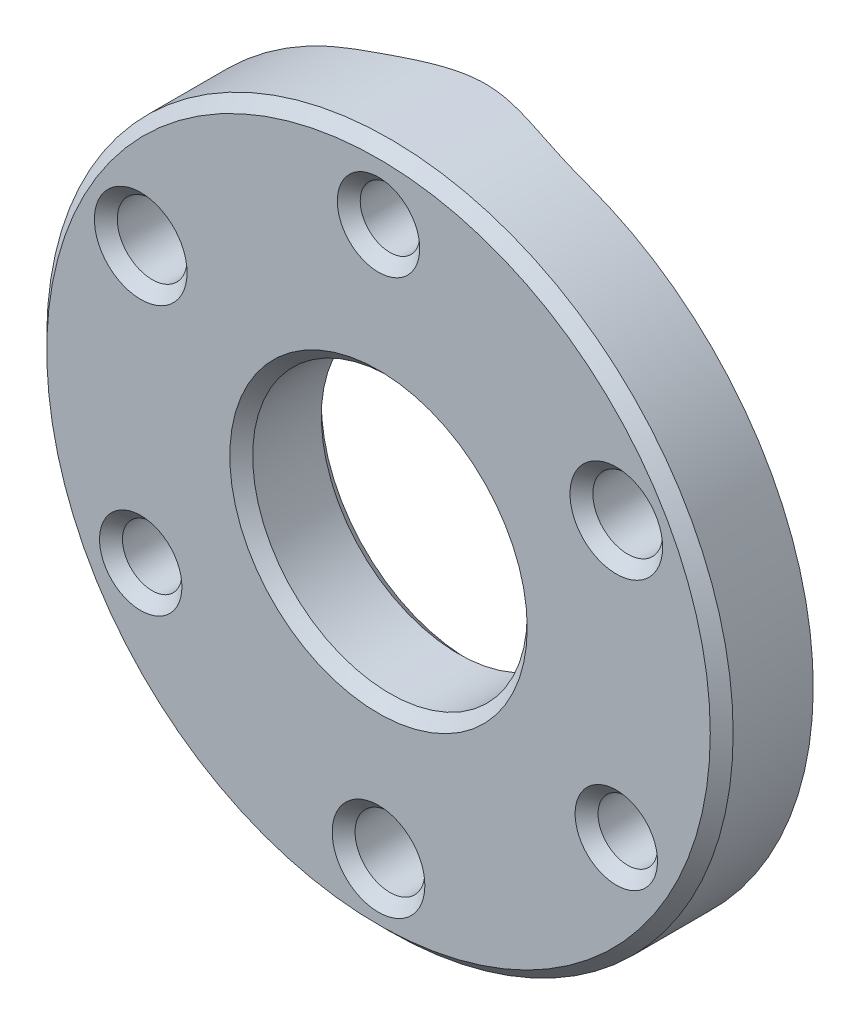
ISO-10303-21;
HEADER;
FILE_DESCRIPTION(('STEP AP214'),'2;1');
FILE_NAME('part.step','',(''),(''),'','','');
FILE_SCHEMA(('AUTOMOTIVE_DESIGN { 1 0 10303 214 1 1 1 1 }'));
ENDSEC;
DATA;
#1=APPLICATION_CONTEXT('core data for automotive mechanical design processes');
#2=APPLICATION_PROTOCOL_DEFINITION('international standard','automotive_design',2000,#1);
#3=PRODUCT_CONTEXT('',#1,'mechanical');
#4=PRODUCT('Part','Part','',(#3));
#5=PRODUCT_RELATED_PRODUCT_CATEGORY('part','',(#4));
#6=PRODUCT_DEFINITION_FORMATION('','',#4);
#7=PRODUCT_DEFINITION_CONTEXT('part definition',#1,'design');
#8=PRODUCT_DEFINITION('design','',#6,#7);
#9=PRODUCT_DEFINITION_SHAPE('','',#8);
#10=(LENGTH_UNIT() NAMED_UNIT(*) SI_UNIT(.MILLI.,.METRE.));
#11=(NAMED_UNIT(*) PLANE_ANGLE_UNIT() SI_UNIT($,.RADIAN.));
#12=(NAMED_UNIT(*) SI_UNIT($,.STERADIAN.) SOLID_ANGLE_UNIT());
#13=UNCERTAINTY_MEASURE_WITH_UNIT(LENGTH_MEASURE(1.E-05),#10,'distance_accuracy_value','');
#14=(GEOMETRIC_REPRESENTATION_CONTEXT(3) GLOBAL_UNCERTAINTY_ASSIGNED_CONTEXT((#13)) GLOBAL_UNIT_ASSIGNED_CONTEXT((#10,
#11,#12)) REPRESENTATION_CONTEXT('',''));
#15=CARTESIAN_POINT('',(0.,0.,0.));
#16=DIRECTION('',(0.,0.,1.));
#17=DIRECTION('',(1.,0.,0.));
#18=AXIS2_PLACEMENT_3D('',#15,#16,#17);
#19=CARTESIAN_POINT('',(0.,0.,0.));
#20=DIRECTION('',(0.,0.,1.));
#21=DIRECTION('',(1.,0.,0.));
#22=AXIS2_PLACEMENT_3D('',#19,#20,#21);
#23=PLANE('',#22);
#24=CARTESIAN_POINT('',(-1.28369537222284E-13,-12.,0.));
#25=DIRECTION('',(0.,0.,1.));
#26=DIRECTION('',(1.,0.,0.));
#27=AXIS2_PLACEMENT_3D('',#24,#25,#26);
#28=CIRCLE('',#27,2.02500000000001);
#29=CARTESIAN_POINT('',(2.02499999999988,-12.,0.));
#30=VERTEX_POINT('',#29);
#31=EDGE_CURVE('E57',#30,#30,#28,.T.);
#32=ORIENTED_EDGE('',*,*,#31,.T.);
#33=EDGE_LOOP('',(#32));
#34=FACE_BOUND('',#33,.T.);
#35=CARTESIAN_POINT('',(-10.3923048454132,6.00000000000016,0.));
#36=DIRECTION('',(0.,0.,1.));
#37=DIRECTION('',(1.,0.,0.));
#38=AXIS2_PLACEMENT_3D('',#35,#36,#37);
#39=CIRCLE('',#38,2.02500000000001);
#40=CARTESIAN_POINT('',(-8.36730484541316,6.00000000000016,0.));
#41=VERTEX_POINT('',#40);
#42=EDGE_CURVE('E480',#41,#41,#39,.T.);
#43=ORIENTED_EDGE('',*,*,#42,.T.);
#44=EDGE_LOOP('',(#43));
#45=FACE_BOUND('',#44,.T.);
#46=CARTESIAN_POINT('',(10.3923048454133,5.99999999999994,0.));
#47=DIRECTION('',(0.,0.,1.));
#48=DIRECTION('',(1.,0.,0.));
#49=AXIS2_PLACEMENT_3D('',#46,#47,#48);
#50=CIRCLE('',#49,2.02500000000001);
#51=CARTESIAN_POINT('',(12.4173048454133,5.99999999999994,0.));
#52=VERTEX_POINT('',#51);
#53=EDGE_CURVE('E470',#52,#52,#50,.T.);
#54=ORIENTED_EDGE('',*,*,#53,.T.);
#55=EDGE_LOOP('',(#54));
#56=FACE_BOUND('',#55,.T.);
#57=CARTESIAN_POINT('',(1.6306400674182E-13,12.,0.));
#58=DIRECTION('',(0.,0.,1.));
#59=DIRECTION('',(1.,0.,0.));
#60=AXIS2_PLACEMENT_3D('',#57,#58,#59);
#61=CIRCLE('',#60,5.5);
#62=CARTESIAN_POINT('',(-5.07725687023878,14.1145833333334,0.));
#63=VERTEX_POINT('',#62);
#64=CARTESIAN_POINT('',(0.,6.5,0.));
#65=VERTEX_POINT('',#64);
#66=EDGE_CURVE('E79',#63,#65,#61,.T.);
#67=ORIENTED_EDGE('',*,*,#66,.T.);
#68=CARTESIAN_POINT('',(0.,0.,0.));
#69=DIRECTION('',(0.,0.,1.));
#70=DIRECTION('',(1.,0.,0.));
#71=AXIS2_PLACEMENT_3D('',#68,#69,#70);
#72=CIRCLE('',#71,6.50000000000001);
#73=EDGE_CURVE('E12',#65,#65,#72,.T.);
#74=ORIENTED_EDGE('',*,*,#73,.T.);
#75=CARTESIAN_POINT('',(5.07725687023917,14.1145833333333,0.));
#76=VERTEX_POINT('',#75);
#77=EDGE_CURVE('E72',#65,#76,#61,.T.);
#78=ORIENTED_EDGE('',*,*,#77,.T.);
#79=CARTESIAN_POINT('',(0.,0.,0.));
#80=DIRECTION('',(0.,0.,1.));
#81=DIRECTION('',(1.,0.,0.));
#82=AXIS2_PLACEMENT_3D('',#79,#80,#81);
#83=CIRCLE('',#82,15.);
#84=EDGE_CURVE('E75',#63,#76,#83,.T.);
#85=ORIENTED_EDGE('',*,*,#84,.F.);
#86=EDGE_LOOP('',(#67,#74,#78,#85));
#87=FACE_BOUND('',#86,.T.);
#88=CARTESIAN_POINT('',(10.3923048454132,-6.00000000000005,0.));
#89=DIRECTION('',(0.,0.,1.));
#90=DIRECTION('',(1.,0.,0.));
#91=AXIS2_PLACEMENT_3D('',#88,#89,#90);
#92=CIRCLE('',#91,2.4);
#93=CARTESIAN_POINT('',(12.7923048454132,-6.00000000000005,0.));
#94=VERTEX_POINT('',#93);
#95=EDGE_CURVE('E89',#94,#94,#92,.T.);
#96=ORIENTED_EDGE('',*,*,#95,.T.);
#97=EDGE_LOOP('',(#96));
#98=FACE_BOUND('',#97,.T.);
#99=CARTESIAN_POINT('',(-10.3923048454133,-5.99999999999991,0.));
#100=DIRECTION('',(0.,0.,1.));
#101=DIRECTION('',(1.,0.,0.));
#102=AXIS2_PLACEMENT_3D('',#99,#100,#101);
#103=CIRCLE('',#102,2.4);
#104=CARTESIAN_POINT('',(-7.99230484541332,-5.99999999999991,0.));
#105=VERTEX_POINT('',#104);
#106=EDGE_CURVE('E95',#105,#105,#103,.T.);
#107=ORIENTED_EDGE('',*,*,#106,.T.);
#108=EDGE_LOOP('',(#107));
#109=FACE_BOUND('',#108,.T.);
#110=ADVANCED_FACE('F47',(#34,#45,#56,#87,#98,#109),#23,.F.);
#111=CARTESIAN_POINT('',(0.,0.,3.));
#112=DIRECTION('',(0.,0.,-1.));
#113=DIRECTION('',(-1.,0.,0.));
#114=AXIS2_PLACEMENT_3D('',#111,#112,#113);
#115=CYLINDRICAL_SURFACE('',#114,15.);
#116=CARTESIAN_POINT('',(0.,0.,3.49999999999999));
#117=DIRECTION('',(0.,0.,1.));
#118=DIRECTION('',(1.,0.,0.));
#119=AXIS2_PLACEMENT_3D('',#116,#117,#118);
#120=CIRCLE('',#119,15.);
#121=CARTESIAN_POINT('',(15.,0.,3.49999999999999));
#122=VERTEX_POINT('',#121);
#123=EDGE_CURVE('E505',#122,#122,#120,.F.);
#124=ORIENTED_EDGE('',*,*,#123,.T.);
#125=EDGE_LOOP('',(#124));
#126=FACE_BOUND('',#125,.T.);
#127=ORIENTED_EDGE('',*,*,#84,.T.);
#128=CARTESIAN_POINT('',(5.07725687023917,14.1145833333333,0.));
#129=CARTESIAN_POINT('',(4.94105848342498,14.1635820971113,2.08635130093524E-05));
#130=CARTESIAN_POINT('',(4.80417405801557,14.2105896585582,-0.00342587186651364));
#131=CARTESIAN_POINT('',(4.52945394339398,14.3005202530031,-0.0166530564790379));
#132=CARTESIAN_POINT('',(4.3916188307357,14.3434455619502,-0.0264299524778217));
#133=CARTESIAN_POINT('',(4.11611783092976,14.4249123594078,-0.0516392212973184));
#134=CARTESIAN_POINT('',(3.97845615424623,14.463479280468,-0.0670362999075104));
#135=CARTESIAN_POINT('',(3.70267611182586,14.5365242904194,-0.102740088044322));
#136=CARTESIAN_POINT('',(3.56455769146458,14.5710018706192,-0.12304740742523));
#137=CARTESIAN_POINT('',(3.28793008290181,14.635905040511,-0.167667377514925));
#138=CARTESIAN_POINT('',(3.1494207002825,14.6663280055367,-0.191982600094951));
#139=CARTESIAN_POINT('',(2.8721067538619,14.7231464218855,-0.243478616243506));
#140=CARTESIAN_POINT('',(2.73330216650309,14.7495415385423,-0.270659647609625));
#141=CARTESIAN_POINT('',(2.45498113167614,14.7984146771754,-0.326559665079048));
#142=CARTESIAN_POINT('',(2.31546378545282,14.8208837627437,-0.355281970229944));
#143=CARTESIAN_POINT('',(2.03581992743691,14.8618777336279,-0.41249577414324));
#144=CARTESIAN_POINT('',(1.89569342234337,14.880402662207,-0.44098727543402));
#145=CARTESIAN_POINT('',(1.5252121894954,14.9240516016692,-0.513086136809838));
#146=CARTESIAN_POINT('',(1.29404600511887,14.9458999905847,-0.55480815545136));
#147=CARTESIAN_POINT('',(0.945229672248521,14.9706399934723,-0.605129248312527));
#148=CARTESIAN_POINT('',(0.828760367274435,14.9775442517359,-0.619848484037692));
#149=CARTESIAN_POINT('',(0.595140788142695,14.9886451206156,-0.644040959820544));
#150=CARTESIAN_POINT('',(0.477990564502231,14.9928419295738,-0.653514584153128));
#151=CARTESIAN_POINT('',(0.243244425158518,14.9984871521564,-0.66635615581241));
#152=CARTESIAN_POINT('',(0.125648386460991,14.9999347421288,-0.669722273347586));
#153=CARTESIAN_POINT('',(-0.1095529694363,15.0000609401634,-0.670013717022539));
#154=CARTESIAN_POINT('',(-0.227158286595882,14.9987395596226,-0.666939069672339));
#155=CARTESIAN_POINT('',(-0.462228043534852,14.9933385038213,-0.654636751874051));
#156=CARTESIAN_POINT('',(-0.579691629723858,14.9892528742823,-0.645395799604362));
#157=CARTESIAN_POINT('',(-0.813944100566443,14.9783593003963,-0.621598408425579));
#158=CARTESIAN_POINT('',(-0.930732932587275,14.9715511465171,-0.607041560399324));
#159=CARTESIAN_POINT('',(-1.2173769688425,14.9514925561195,-0.566105657808445));
#160=CARTESIAN_POINT('',(-1.38678315684688,14.9367188435366,-0.537372943319522));
#161=CARTESIAN_POINT('',(-1.72412487586946,14.9015493907687,-0.475134484400073));
#162=CARTESIAN_POINT('',(-1.8920599927247,14.8811521166989,-0.441627438927914));
#163=CARTESIAN_POINT('',(-2.22681861656628,14.8347500069596,-0.373569990978726));
#164=CARTESIAN_POINT('',(-2.3936427904564,14.8087489217033,-0.339020299539199));
#165=CARTESIAN_POINT('',(-2.72669268925573,14.751057650349,-0.271872604506607));
#166=CARTESIAN_POINT('',(-2.89291846801079,14.7193679898798,-0.239274420963505));
#167=CARTESIAN_POINT('',(-3.22798739390478,14.6495700322255,-0.177854213611634));
#168=CARTESIAN_POINT('',(-3.3968233866239,14.6113558287444,-0.149111322006094));
#169=CARTESIAN_POINT('',(-3.73396567828567,14.52885431665,-0.0980756792855815));
#170=CARTESIAN_POINT('',(-3.90227208187898,14.4845682965046,-0.0757815628231853));
#171=CARTESIAN_POINT('',(-4.23915431701849,14.3895927694164,-0.0390404435013658));
#172=CARTESIAN_POINT('',(-4.40772488107008,14.3388637921583,-0.0246449962909613));
#173=CARTESIAN_POINT('',(-4.65959600380171,14.2581890218715,-0.0100027736625224));
#174=CARTESIAN_POINT('',(-4.74343598001448,14.2305169617321,-0.00628038919377368));
#175=CARTESIAN_POINT('',(-4.91068851506231,14.17367076181,-0.00127813107984774));
#176=CARTESIAN_POINT('',(-4.99410102408918,14.1444964511731,1.46410885882819E-06));
#177=CARTESIAN_POINT('',(-5.07725687023878,14.1145833333334,0.));
#178=B_SPLINE_CURVE_WITH_KNOTS('',3,(#128,#129,#130,#131,#132,#133,#134,#135,#136,#137,#138,
#139,#140,#141,#142,#143,#144,#145,#146,#147,#148,#149,#150,#151,#152,#153,#154,#155,#156,#157,
#158,#159,#160,#161,#162,#163,#164,#165,#166,#167,#168,#169,#170,#171,#172,#173,#174,#175,#176,
#177),.UNSPECIFIED.,.F.,.F.,(4,2,2,2,2,2,2,2,2,2,2,2,2,2,2,2,2,2,2,2,2,2,2,2,4),(0.,
0.434134035704884,0.868024595102362,1.29923596728143,1.73050092365706,2.16204370787645,
2.59362232865189,3.02617085917778,3.45871464485258,4.16582980381193,4.51850413837089,
4.87115263383898,5.22390676435057,5.57665944293813,5.93017439116751,6.28371655203045,
6.80083852495856,7.31810168804227,7.83501973606655,8.35189004502894,8.87812657402339,
9.40425160549211,9.93377106668686,10.1988302615721,10.4639196690682),.UNSPECIFIED.);
#179=EDGE_CURVE('E66',#76,#63,#178,.T.);
#180=ORIENTED_EDGE('',*,*,#179,.T.);
#181=EDGE_LOOP('',(#127,#180));
#182=FACE_BOUND('',#181,.T.);
#183=ADVANCED_FACE('F87',(#126,#182),#115,.T.);
#184=CARTESIAN_POINT('',(10.3923048454132,-6.00000000000005,3.));
#185=DIRECTION('',(0.,0.,-1.));
#186=DIRECTION('',(-1.,0.,0.));
#187=AXIS2_PLACEMENT_3D('',#184,#185,#186);
#188=CYLINDRICAL_SURFACE('',#187,1.3);
#189=CARTESIAN_POINT('',(10.3923048454132,-6.00000000000005,3.5));
#190=DIRECTION('',(0.,0.,1.));
#191=DIRECTION('',(1.,0.,0.));
#192=AXIS2_PLACEMENT_3D('',#189,#190,#191);
#193=CIRCLE('',#192,1.3);
#194=CARTESIAN_POINT('',(11.6923048454132,-6.00000000000005,3.5));
#195=VERTEX_POINT('',#194);
#196=EDGE_CURVE('E466',#195,#195,#193,.T.);
#197=ORIENTED_EDGE('',*,*,#196,.T.);
#198=EDGE_LOOP('',(#197));
#199=FACE_BOUND('',#198,.T.);
#200=CARTESIAN_POINT('',(10.3923048454132,-6.00000000000005,1.1));
#201=DIRECTION('',(0.,0.,1.));
#202=DIRECTION('',(1.,0.,0.));
#203=AXIS2_PLACEMENT_3D('',#200,#201,#202);
#204=CIRCLE('',#203,1.3);
#205=CARTESIAN_POINT('',(11.6923048454132,-6.00000000000005,1.1));
#206=VERTEX_POINT('',#205);
#207=EDGE_CURVE('E80',#206,#206,#204,.F.);
#208=ORIENTED_EDGE('',*,*,#207,.T.);
#209=EDGE_LOOP('',(#208));
#210=FACE_BOUND('',#209,.T.);
#211=ADVANCED_FACE('F217',(#199,#210),#188,.F.);
#212=CARTESIAN_POINT('',(-10.3923048454133,-5.99999999999991,3.));
#213=DIRECTION('',(0.,0.,-1.));
#214=DIRECTION('',(-1.,0.,0.));
#215=AXIS2_PLACEMENT_3D('',#212,#213,#214);
#216=CYLINDRICAL_SURFACE('',#215,1.3);
#217=CARTESIAN_POINT('',(-10.3923048454133,-5.99999999999991,3.5));
#218=DIRECTION('',(0.,0.,1.));
#219=DIRECTION('',(1.,0.,0.));
#220=AXIS2_PLACEMENT_3D('',#217,#218,#219);
#221=CIRCLE('',#220,1.3);
#222=CARTESIAN_POINT('',(-9.09230484541332,-5.99999999999991,3.5));
#223=VERTEX_POINT('',#222);
#224=EDGE_CURVE('E473',#223,#223,#221,.T.);
#225=ORIENTED_EDGE('',*,*,#224,.T.);
#226=EDGE_LOOP('',(#225));
#227=FACE_BOUND('',#226,.T.);
#228=CARTESIAN_POINT('',(-10.3923048454133,-5.99999999999991,1.1));
#229=DIRECTION('',(0.,0.,1.));
#230=DIRECTION('',(1.,0.,0.));
#231=AXIS2_PLACEMENT_3D('',#228,#229,#230);
#232=CIRCLE('',#231,1.3);
#233=CARTESIAN_POINT('',(-9.09230484541332,-5.99999999999991,1.1));
#234=VERTEX_POINT('',#233);
#235=EDGE_CURVE('E105',#234,#234,#232,.F.);
#236=ORIENTED_EDGE('',*,*,#235,.T.);
#237=EDGE_LOOP('',(#236));
#238=FACE_BOUND('',#237,.T.);
#239=ADVANCED_FACE('F224',(#227,#238),#216,.F.);
#240=CARTESIAN_POINT('',(1.6306400674182E-13,12.,3.));
#241=DIRECTION('',(0.,0.,-1.));
#242=DIRECTION('',(-1.,0.,0.));
#243=AXIS2_PLACEMENT_3D('',#240,#241,#242);
#244=CYLINDRICAL_SURFACE('',#243,1.3);
#245=CARTESIAN_POINT('',(1.6306400674182E-13,12.,3.5));
#246=DIRECTION('',(0.,0.,1.));
#247=DIRECTION('',(1.,0.,0.));
#248=AXIS2_PLACEMENT_3D('',#245,#246,#247);
#249=CIRCLE('',#248,1.3);
#250=CARTESIAN_POINT('',(1.30000000000016,12.,3.5));
#251=VERTEX_POINT('',#250);
#252=EDGE_CURVE('E493',#251,#251,#249,.T.);
#253=ORIENTED_EDGE('',*,*,#252,.T.);
#254=EDGE_LOOP('',(#253));
#255=FACE_BOUND('',#254,.T.);
#256=CARTESIAN_POINT('',(1.6306400674182E-13,12.,-1.));
#257=DIRECTION('',(0.,0.,-1.));
#258=DIRECTION('',(-1.,0.,0.));
#259=AXIS2_PLACEMENT_3D('',#256,#257,#258);
#260=CIRCLE('',#259,1.3);
#261=CARTESIAN_POINT('',(-1.29999999999984,12.,-1.));
#262=VERTEX_POINT('',#261);
#263=EDGE_CURVE('E98',#262,#262,#260,.T.);
#264=ORIENTED_EDGE('',*,*,#263,.T.);
#265=EDGE_LOOP('',(#264));
#266=FACE_BOUND('',#265,.T.);
#267=ADVANCED_FACE('F228',(#255,#266),#244,.F.);
#268=CARTESIAN_POINT('',(-10.3923048454132,6.00000000000016,4.));
#269=DIRECTION('',(0.,0.,-1.));
#270=DIRECTION('',(-1.,0.,0.));
#271=AXIS2_PLACEMENT_3D('',#268,#269,#270);
#272=CYLINDRICAL_SURFACE('',#271,1.525);
#273=CARTESIAN_POINT('',(-10.3923048454132,6.00000000000016,3.5));
#274=DIRECTION('',(0.,0.,1.));
#275=DIRECTION('',(1.,0.,0.));
#276=AXIS2_PLACEMENT_3D('',#273,#274,#275);
#277=CIRCLE('',#276,1.525);
#278=CARTESIAN_POINT('',(-8.86730484541317,6.00000000000016,3.5));
#279=VERTEX_POINT('',#278);
#280=EDGE_CURVE('E548',#279,#279,#277,.T.);
#281=ORIENTED_EDGE('',*,*,#280,.T.);
#282=EDGE_LOOP('',(#281));
#283=FACE_BOUND('',#282,.T.);
#284=CARTESIAN_POINT('',(-10.3923048454132,6.00000000000016,0.500000000000014));
#285=DIRECTION('',(0.,0.,1.));
#286=DIRECTION('',(1.,0.,0.));
#287=AXIS2_PLACEMENT_3D('',#284,#285,#286);
#288=CIRCLE('',#287,1.525);
#289=CARTESIAN_POINT('',(-8.86730484541317,6.00000000000016,0.500000000000014));
#290=VERTEX_POINT('',#289);
#291=EDGE_CURVE('E85',#290,#290,#288,.F.);
#292=ORIENTED_EDGE('',*,*,#291,.T.);
#293=EDGE_LOOP('',(#292));
#294=FACE_BOUND('',#293,.T.);
#295=ADVANCED_FACE('F232',(#283,#294),#272,.F.);
#296=CARTESIAN_POINT('',(-1.28369537222284E-13,-12.,4.));
#297=DIRECTION('',(0.,0.,-1.));
#298=DIRECTION('',(-1.,0.,0.));
#299=AXIS2_PLACEMENT_3D('',#296,#297,#298);
#300=CYLINDRICAL_SURFACE('',#299,1.525);
#301=CARTESIAN_POINT('',(-1.28369537222284E-13,-12.,3.5));
#302=DIRECTION('',(0.,0.,1.));
#303=DIRECTION('',(1.,0.,0.));
#304=AXIS2_PLACEMENT_3D('',#301,#302,#303);
#305=CIRCLE('',#304,1.525);
#306=CARTESIAN_POINT('',(1.52499999999987,-12.,3.5));
#307=VERTEX_POINT('',#306);
#308=EDGE_CURVE('E497',#307,#307,#305,.T.);
#309=ORIENTED_EDGE('',*,*,#308,.T.);
#310=EDGE_LOOP('',(#309));
#311=FACE_BOUND('',#310,.T.);
#312=CARTESIAN_POINT('',(-1.28369537222284E-13,-12.,0.500000000000015));
#313=DIRECTION('',(0.,0.,1.));
#314=DIRECTION('',(1.,0.,0.));
#315=AXIS2_PLACEMENT_3D('',#312,#313,#314);
#316=CIRCLE('',#315,1.525);
#317=CARTESIAN_POINT('',(1.52499999999987,-12.,0.500000000000015));
#318=VERTEX_POINT('',#317);
#319=EDGE_CURVE('E501',#318,#318,#316,.F.);
#320=ORIENTED_EDGE('',*,*,#319,.T.);
#321=EDGE_LOOP('',(#320));
#322=FACE_BOUND('',#321,.T.);
#323=ADVANCED_FACE('F242',(#311,#322),#300,.F.);
#324=CARTESIAN_POINT('',(10.3923048454133,5.99999999999994,4.));
#325=DIRECTION('',(0.,0.,-1.));
#326=DIRECTION('',(-1.,0.,0.));
#327=AXIS2_PLACEMENT_3D('',#324,#325,#326);
#328=CYLINDRICAL_SURFACE('',#327,1.525);
#329=CARTESIAN_POINT('',(10.3923048454133,5.99999999999994,3.49999999999999));
#330=DIRECTION('',(0.,0.,1.));
#331=DIRECTION('',(1.,0.,0.));
#332=AXIS2_PLACEMENT_3D('',#329,#330,#331);
#333=CIRCLE('',#332,1.525);
#334=CARTESIAN_POINT('',(11.9173048454133,5.99999999999994,3.49999999999999));
#335=VERTEX_POINT('',#334);
#336=EDGE_CURVE('E509',#335,#335,#333,.T.);
#337=ORIENTED_EDGE('',*,*,#336,.T.);
#338=EDGE_LOOP('',(#337));
#339=FACE_BOUND('',#338,.T.);
#340=CARTESIAN_POINT('',(10.3923048454133,5.99999999999994,0.500000000000012));
#341=DIRECTION('',(0.,0.,1.));
#342=DIRECTION('',(1.,0.,0.));
#343=AXIS2_PLACEMENT_3D('',#340,#341,#342);
#344=CIRCLE('',#343,1.525);
#345=CARTESIAN_POINT('',(11.9173048454133,5.99999999999994,0.500000000000012));
#346=VERTEX_POINT('',#345);
#347=EDGE_CURVE('E513',#346,#346,#344,.F.);
#348=ORIENTED_EDGE('',*,*,#347,.T.);
#349=EDGE_LOOP('',(#348));
#350=FACE_BOUND('',#349,.T.);
#351=ADVANCED_FACE('F238',(#339,#350),#328,.F.);
#352=CARTESIAN_POINT('',(0.,0.,4.));
#353=DIRECTION('',(0.,0.,1.));
#354=DIRECTION('',(1.,0.,0.));
#355=AXIS2_PLACEMENT_3D('',#352,#353,#354);
#356=PLANE('',#355);
#357=CARTESIAN_POINT('',(-10.3923048454132,6.00000000000016,4.));
#358=DIRECTION('',(0.,0.,1.));
#359=DIRECTION('',(1.,0.,0.));
#360=AXIS2_PLACEMENT_3D('',#357,#358,#359);
#361=CIRCLE('',#360,2.025);
#362=CARTESIAN_POINT('',(-8.36730484541317,6.00000000000016,4.));
#363=VERTEX_POINT('',#362);
#364=EDGE_CURVE('E517',#363,#363,#361,.F.);
#365=ORIENTED_EDGE('',*,*,#364,.T.);
#366=EDGE_LOOP('',(#365));
#367=FACE_BOUND('',#366,.T.);
#368=CARTESIAN_POINT('',(10.3923048454133,5.99999999999994,4.));
#369=DIRECTION('',(0.,0.,1.));
#370=DIRECTION('',(1.,0.,0.));
#371=AXIS2_PLACEMENT_3D('',#368,#369,#370);
#372=CIRCLE('',#371,2.02500000000002);
#373=CARTESIAN_POINT('',(12.4173048454133,5.99999999999994,4.));
#374=VERTEX_POINT('',#373);
#375=EDGE_CURVE('E521',#374,#374,#372,.F.);
#376=ORIENTED_EDGE('',*,*,#375,.T.);
#377=EDGE_LOOP('',(#376));
#378=FACE_BOUND('',#377,.T.);
#379=CARTESIAN_POINT('',(0.,0.,4.));
#380=DIRECTION('',(0.,0.,1.));
#381=DIRECTION('',(1.,0.,0.));
#382=AXIS2_PLACEMENT_3D('',#379,#380,#381);
#383=CIRCLE('',#382,14.5);
#384=CARTESIAN_POINT('',(14.5,0.,4.));
#385=VERTEX_POINT('',#384);
#386=EDGE_CURVE('E525',#385,#385,#383,.T.);
#387=ORIENTED_EDGE('',*,*,#386,.T.);
#388=EDGE_LOOP('',(#387));
#389=FACE_BOUND('',#388,.T.);
#390=CARTESIAN_POINT('',(-1.28369537222284E-13,-12.,4.));
#391=DIRECTION('',(0.,0.,1.));
#392=DIRECTION('',(1.,0.,0.));
#393=AXIS2_PLACEMENT_3D('',#390,#391,#392);
#394=CIRCLE('',#393,2.025);
#395=CARTESIAN_POINT('',(2.02499999999987,-12.,4.));
#396=VERTEX_POINT('',#395);
#397=EDGE_CURVE('E529',#396,#396,#394,.F.);
#398=ORIENTED_EDGE('',*,*,#397,.T.);
#399=EDGE_LOOP('',(#398));
#400=FACE_BOUND('',#399,.T.);
#401=CARTESIAN_POINT('',(1.6306400674182E-13,12.,4.));
#402=DIRECTION('',(0.,0.,1.));
#403=DIRECTION('',(1.,0.,0.));
#404=AXIS2_PLACEMENT_3D('',#401,#402,#403);
#405=CIRCLE('',#404,1.8);
#406=CARTESIAN_POINT('',(1.80000000000017,12.,4.));
#407=VERTEX_POINT('',#406);
#408=EDGE_CURVE('E533',#407,#407,#405,.F.);
#409=ORIENTED_EDGE('',*,*,#408,.T.);
#410=EDGE_LOOP('',(#409));
#411=FACE_BOUND('',#410,.T.);
#412=CARTESIAN_POINT('',(-10.3923048454133,-5.99999999999991,4.));
#413=DIRECTION('',(0.,0.,1.));
#414=DIRECTION('',(1.,0.,0.));
#415=AXIS2_PLACEMENT_3D('',#412,#413,#414);
#416=CIRCLE('',#415,1.8);
#417=CARTESIAN_POINT('',(-8.59230484541332,-5.99999999999991,4.));
#418=VERTEX_POINT('',#417);
#419=EDGE_CURVE('E537',#418,#418,#416,.F.);
#420=ORIENTED_EDGE('',*,*,#419,.T.);
#421=EDGE_LOOP('',(#420));
#422=FACE_BOUND('',#421,.T.);
#423=CARTESIAN_POINT('',(10.3923048454132,-6.00000000000005,4.));
#424=DIRECTION('',(0.,0.,1.));
#425=DIRECTION('',(1.,0.,0.));
#426=AXIS2_PLACEMENT_3D('',#423,#424,#425);
#427=CIRCLE('',#426,1.8);
#428=CARTESIAN_POINT('',(12.1923048454132,-6.00000000000005,4.));
#429=VERTEX_POINT('',#428);
#430=EDGE_CURVE('E541',#429,#429,#427,.F.);
#431=ORIENTED_EDGE('',*,*,#430,.T.);
#432=EDGE_LOOP('',(#431));
#433=FACE_BOUND('',#432,.T.);
#434=CARTESIAN_POINT('',(0.,0.,4.));
#435=DIRECTION('',(0.,0.,1.));
#436=DIRECTION('',(1.,0.,0.));
#437=AXIS2_PLACEMENT_3D('',#434,#435,#436);
#438=CIRCLE('',#437,6.50000000000001);
#439=CARTESIAN_POINT('',(6.50000000000001,0.,4.));
#440=VERTEX_POINT('',#439);
#441=EDGE_CURVE('E545',#440,#440,#438,.F.);
#442=ORIENTED_EDGE('',*,*,#441,.T.);
#443=EDGE_LOOP('',(#442));
#444=FACE_BOUND('',#443,.T.);
#445=ADVANCED_FACE('F234',(#367,#378,#389,#400,#411,#422,#433,#444),#356,.T.);
#446=CARTESIAN_POINT('',(0.,0.,0.));
#447=DIRECTION('',(0.,0.,1.));
#448=DIRECTION('',(1.,0.,0.));
#449=AXIS2_PLACEMENT_3D('',#446,#447,#448);
#450=CYLINDRICAL_SURFACE('',#449,6.);
#451=CARTESIAN_POINT('',(0.,0.,3.5));
#452=DIRECTION('',(0.,0.,1.));
#453=DIRECTION('',(1.,0.,0.));
#454=AXIS2_PLACEMENT_3D('',#451,#452,#453);
#455=CIRCLE('',#454,6.);
#456=CARTESIAN_POINT('',(6.,0.,3.5));
#457=VERTEX_POINT('',#456);
#458=EDGE_CURVE('E461',#457,#457,#455,.T.);
#459=ORIENTED_EDGE('',*,*,#458,.T.);
#460=EDGE_LOOP('',(#459));
#461=FACE_BOUND('',#460,.T.);
#462=CARTESIAN_POINT('',(0.,0.,0.500000000000007));
#463=DIRECTION('',(0.,0.,1.));
#464=DIRECTION('',(1.,0.,0.));
#465=AXIS2_PLACEMENT_3D('',#462,#463,#464);
#466=CIRCLE('',#465,6.);
#467=CARTESIAN_POINT('',(6.,0.,0.500000000000007));
#468=VERTEX_POINT('',#467);
#469=EDGE_CURVE('E464',#468,#468,#466,.F.);
#470=ORIENTED_EDGE('',*,*,#469,.T.);
#471=EDGE_LOOP('',(#470));
#472=FACE_BOUND('',#471,.T.);
#473=ADVANCED_FACE('F237',(#461,#472),#450,.F.);
#474=CARTESIAN_POINT('',(-10.3923048454133,-5.99999999999991,0.));
#475=DIRECTION('',(0.,0.,-1.));
#476=DIRECTION('',(-1.,0.,0.));
#477=AXIS2_PLACEMENT_3D('',#474,#475,#476);
#478=CONICAL_SURFACE('',#477,2.4,0.785398163397447);
#479=ORIENTED_EDGE('',*,*,#235,.F.);
#480=EDGE_LOOP('',(#479));
#481=FACE_BOUND('',#480,.T.);
#482=ORIENTED_EDGE('',*,*,#106,.F.);
#483=EDGE_LOOP('',(#482));
#484=FACE_BOUND('',#483,.T.);
#485=ADVANCED_FACE('F252',(#481,#484),#478,.F.);
#486=CARTESIAN_POINT('',(10.3923048454132,-6.00000000000005,0.));
#487=DIRECTION('',(0.,0.,-1.));
#488=DIRECTION('',(-1.,0.,0.));
#489=AXIS2_PLACEMENT_3D('',#486,#487,#488);
#490=CONICAL_SURFACE('',#489,2.4,0.785398163397446);
#491=ORIENTED_EDGE('',*,*,#207,.F.);
#492=EDGE_LOOP('',(#491));
#493=FACE_BOUND('',#492,.T.);
#494=ORIENTED_EDGE('',*,*,#95,.F.);
#495=EDGE_LOOP('',(#494));
#496=FACE_BOUND('',#495,.T.);
#497=ADVANCED_FACE('F130',(#493,#496),#490,.F.);
#498=CARTESIAN_POINT('',(1.6306400674182E-13,12.,-1.));
#499=DIRECTION('',(0.,0.,-1.));
#500=DIRECTION('',(-1.,0.,0.));
#501=AXIS2_PLACEMENT_3D('',#498,#499,#500);
#502=PLANE('',#501);
#503=CARTESIAN_POINT('',(1.6306400674182E-13,12.,-1.));
#504=DIRECTION('',(0.,0.,-1.));
#505=DIRECTION('',(-1.,0.,0.));
#506=AXIS2_PLACEMENT_3D('',#503,#504,#505);
#507=CIRCLE('',#506,2.5);
#508=CARTESIAN_POINT('',(-2.49999999999984,12.,-1.));
#509=VERTEX_POINT('',#508);
#510=EDGE_CURVE('E90',#509,#509,#507,.T.);
#511=ORIENTED_EDGE('',*,*,#510,.T.);
#512=EDGE_LOOP('',(#511));
#513=FACE_BOUND('',#512,.T.);
#514=ORIENTED_EDGE('',*,*,#263,.F.);
#515=EDGE_LOOP('',(#514));
#516=FACE_BOUND('',#515,.T.);
#517=ADVANCED_FACE('F128',(#513,#516),#502,.T.);
#518=CARTESIAN_POINT('',(1.6306400674182E-13,12.,-5.));
#519=DIRECTION('',(0.,0.,1.));
#520=DIRECTION('',(1.,0.,0.));
#521=AXIS2_PLACEMENT_3D('',#518,#519,#520);
#522=TOROIDAL_SURFACE('',#521,5.5,5.);
#523=ORIENTED_EDGE('',*,*,#179,.F.);
#524=ORIENTED_EDGE('',*,*,#77,.F.);
#525=ORIENTED_EDGE('',*,*,#66,.F.);
#526=EDGE_LOOP('',(#523,#524,#525));
#527=FACE_BOUND('',#526,.T.);
#528=ORIENTED_EDGE('',*,*,#510,.F.);
#529=EDGE_LOOP('',(#528));
#530=FACE_BOUND('',#529,.T.);
#531=ADVANCED_FACE('F82',(#527,#530),#522,.F.);
#532=CARTESIAN_POINT('',(-10.3923048454132,6.00000000000016,3.5));
#533=DIRECTION('',(0.,0.,1.));
#534=DIRECTION('',(1.,0.,0.));
#535=AXIS2_PLACEMENT_3D('',#532,#533,#534);
#536=CONICAL_SURFACE('',#535,1.525,0.785398163397447);
#537=ORIENTED_EDGE('',*,*,#364,.F.);
#538=EDGE_LOOP('',(#537));
#539=FACE_BOUND('',#538,.T.);
#540=ORIENTED_EDGE('',*,*,#280,.F.);
#541=EDGE_LOOP('',(#540));
#542=FACE_BOUND('',#541,.T.);
#543=ADVANCED_FACE('F127',(#539,#542),#536,.F.);
#544=CARTESIAN_POINT('',(10.3923048454133,5.99999999999994,3.49999999999999));
#545=DIRECTION('',(0.,0.,1.));
#546=DIRECTION('',(1.,0.,0.));
#547=AXIS2_PLACEMENT_3D('',#544,#545,#546);
#548=CONICAL_SURFACE('',#547,1.525,0.785398163397453);
#549=ORIENTED_EDGE('',*,*,#375,.F.);
#550=EDGE_LOOP('',(#549));
#551=FACE_BOUND('',#550,.T.);
#552=ORIENTED_EDGE('',*,*,#336,.F.);
#553=EDGE_LOOP('',(#552));
#554=FACE_BOUND('',#553,.T.);
#555=ADVANCED_FACE('F137',(#551,#554),#548,.F.);
#556=CARTESIAN_POINT('',(0.,0.,4.));
#557=DIRECTION('',(0.,0.,-1.));
#558=DIRECTION('',(-1.,0.,0.));
#559=AXIS2_PLACEMENT_3D('',#556,#557,#558);
#560=CONICAL_SURFACE('',#559,14.5,0.785398163397441);
#561=ORIENTED_EDGE('',*,*,#123,.F.);
#562=EDGE_LOOP('',(#561));
#563=FACE_BOUND('',#562,.T.);
#564=ORIENTED_EDGE('',*,*,#386,.F.);
#565=EDGE_LOOP('',(#564));
#566=FACE_BOUND('',#565,.T.);
#567=ADVANCED_FACE('F144',(#563,#566),#560,.T.);
#568=CARTESIAN_POINT('',(-1.28369537222284E-13,-12.,3.5));
#569=DIRECTION('',(0.,0.,1.));
#570=DIRECTION('',(1.,0.,0.));
#571=AXIS2_PLACEMENT_3D('',#568,#569,#570);
#572=CONICAL_SURFACE('',#571,1.525,0.785398163397447);
#573=ORIENTED_EDGE('',*,*,#397,.F.);
#574=EDGE_LOOP('',(#573));
#575=FACE_BOUND('',#574,.T.);
#576=ORIENTED_EDGE('',*,*,#308,.F.);
#577=EDGE_LOOP('',(#576));
#578=FACE_BOUND('',#577,.T.);
#579=ADVANCED_FACE('F151',(#575,#578),#572,.F.);
#580=CARTESIAN_POINT('',(1.6306400674182E-13,12.,3.5));
#581=DIRECTION('',(0.,0.,1.));
#582=DIRECTION('',(1.,0.,0.));
#583=AXIS2_PLACEMENT_3D('',#580,#581,#582);
#584=CONICAL_SURFACE('',#583,1.3,0.785398163397447);
#585=ORIENTED_EDGE('',*,*,#408,.F.);
#586=EDGE_LOOP('',(#585));
#587=FACE_BOUND('',#586,.T.);
#588=ORIENTED_EDGE('',*,*,#252,.F.);
#589=EDGE_LOOP('',(#588));
#590=FACE_BOUND('',#589,.T.);
#591=ADVANCED_FACE('F158',(#587,#590),#584,.F.);
#592=CARTESIAN_POINT('',(-10.3923048454133,-5.99999999999991,3.5));
#593=DIRECTION('',(0.,0.,1.));
#594=DIRECTION('',(1.,0.,0.));
#595=AXIS2_PLACEMENT_3D('',#592,#593,#594);
#596=CONICAL_SURFACE('',#595,1.3,0.785398163397447);
#597=ORIENTED_EDGE('',*,*,#419,.F.);
#598=EDGE_LOOP('',(#597));
#599=FACE_BOUND('',#598,.T.);
#600=ORIENTED_EDGE('',*,*,#224,.F.);
#601=EDGE_LOOP('',(#600));
#602=FACE_BOUND('',#601,.T.);
#603=ADVANCED_FACE('F165',(#599,#602),#596,.F.);
#604=CARTESIAN_POINT('',(10.3923048454132,-6.00000000000005,3.5));
#605=DIRECTION('',(0.,0.,1.));
#606=DIRECTION('',(1.,0.,0.));
#607=AXIS2_PLACEMENT_3D('',#604,#605,#606);
#608=CONICAL_SURFACE('',#607,1.3,0.785398163397447);
#609=ORIENTED_EDGE('',*,*,#430,.F.);
#610=EDGE_LOOP('',(#609));
#611=FACE_BOUND('',#610,.T.);
#612=ORIENTED_EDGE('',*,*,#196,.F.);
#613=EDGE_LOOP('',(#612));
#614=FACE_BOUND('',#613,.T.);
#615=ADVANCED_FACE('F172',(#611,#614),#608,.F.);
#616=CARTESIAN_POINT('',(0.,0.,3.5));
#617=DIRECTION('',(0.,0.,1.));
#618=DIRECTION('',(1.,0.,0.));
#619=AXIS2_PLACEMENT_3D('',#616,#617,#618);
#620=CONICAL_SURFACE('',#619,6.,0.785398163397452);
#621=ORIENTED_EDGE('',*,*,#441,.F.);
#622=EDGE_LOOP('',(#621));
#623=FACE_BOUND('',#622,.T.);
#624=ORIENTED_EDGE('',*,*,#458,.F.);
#625=EDGE_LOOP('',(#624));
#626=FACE_BOUND('',#625,.T.);
#627=ADVANCED_FACE('F179',(#623,#626),#620,.F.);
#628=CARTESIAN_POINT('',(0.,0.,0.));
#629=DIRECTION('',(0.,0.,-1.));
#630=DIRECTION('',(-1.,0.,0.));
#631=AXIS2_PLACEMENT_3D('',#628,#629,#630);
#632=CONICAL_SURFACE('',#631,6.50000000000001,0.785398163397446);
#633=ORIENTED_EDGE('',*,*,#469,.F.);
#634=EDGE_LOOP('',(#633));
#635=FACE_BOUND('',#634,.T.);
#636=ORIENTED_EDGE('',*,*,#73,.F.);
#637=EDGE_LOOP('',(#636));
#638=FACE_BOUND('',#637,.T.);
#639=ADVANCED_FACE('F186',(#635,#638),#632,.F.);
#640=CARTESIAN_POINT('',(-1.28369537222284E-13,-12.,0.));
#641=DIRECTION('',(0.,0.,-1.));
#642=DIRECTION('',(-1.,0.,0.));
#643=AXIS2_PLACEMENT_3D('',#640,#641,#642);
#644=CONICAL_SURFACE('',#643,2.02500000000001,0.785398163397447);
#645=ORIENTED_EDGE('',*,*,#319,.F.);
#646=EDGE_LOOP('',(#645));
#647=FACE_BOUND('',#646,.T.);
#648=ORIENTED_EDGE('',*,*,#31,.F.);
#649=EDGE_LOOP('',(#648));
#650=FACE_BOUND('',#649,.T.);
#651=ADVANCED_FACE('F193',(#647,#650),#644,.F.);
#652=CARTESIAN_POINT('',(-10.3923048454132,6.00000000000016,0.));
#653=DIRECTION('',(0.,0.,-1.));
#654=DIRECTION('',(-1.,0.,0.));
#655=AXIS2_PLACEMENT_3D('',#652,#653,#654);
#656=CONICAL_SURFACE('',#655,2.02500000000001,0.785398163397447);
#657=ORIENTED_EDGE('',*,*,#291,.F.);
#658=EDGE_LOOP('',(#657));
#659=FACE_BOUND('',#658,.T.);
#660=ORIENTED_EDGE('',*,*,#42,.F.);
#661=EDGE_LOOP('',(#660));
#662=FACE_BOUND('',#661,.T.);
#663=ADVANCED_FACE('F199',(#659,#662),#656,.F.);
#664=CARTESIAN_POINT('',(10.3923048454133,5.99999999999994,0.));
#665=DIRECTION('',(0.,0.,-1.));
#666=DIRECTION('',(-1.,0.,0.));
#667=AXIS2_PLACEMENT_3D('',#664,#665,#666);
#668=CONICAL_SURFACE('',#667,2.02500000000001,0.785398163397447);
#669=ORIENTED_EDGE('',*,*,#347,.F.);
#670=EDGE_LOOP('',(#669));
#671=FACE_BOUND('',#670,.T.);
#672=ORIENTED_EDGE('',*,*,#53,.F.);
#673=EDGE_LOOP('',(#672));
#674=FACE_BOUND('',#673,.T.);
#675=ADVANCED_FACE('F50',(#671,#674),#668,.F.);
#676=CLOSED_SHELL('',(#110,#183,#211,#239,#267,#295,#323,#351,#445,#473,#485,#497,#517,#531,
#543,#555,#567,#579,#591,#603,#615,#627,#639,#651,#663,#675));
#677=MANIFOLD_SOLID_BREP('B2',#676);
#678=ADVANCED_BREP_SHAPE_REPRESENTATION('',(#18,#677),#14);
#679=SHAPE_DEFINITION_REPRESENTATION(#9,#678);
ENDSEC;
END-ISO-10303-21;
